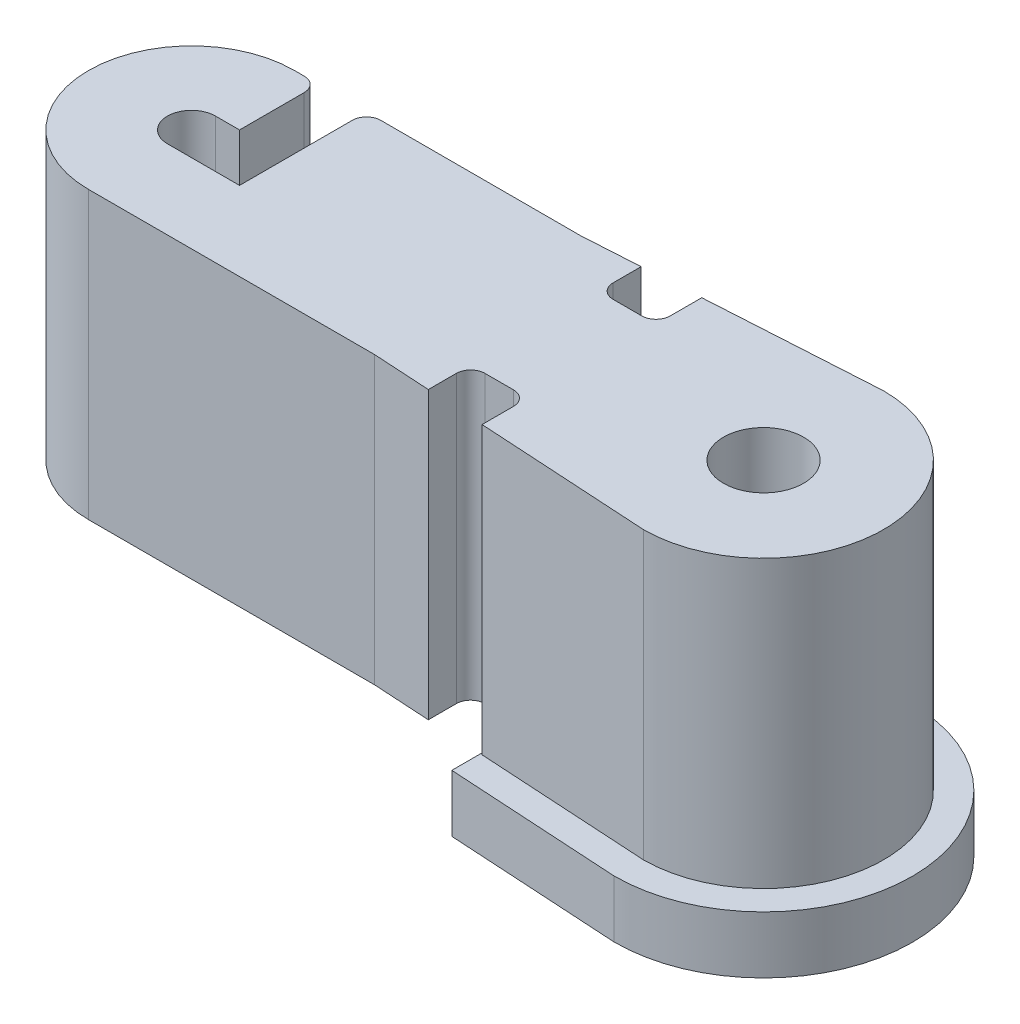
ISO-10303-21;
HEADER;
FILE_DESCRIPTION(('STEP AP214'),'2;1');
FILE_NAME('part.step','',(''),(''),'','','');
FILE_SCHEMA(('AUTOMOTIVE_DESIGN { 1 0 10303 214 1 1 1 1 }'));
ENDSEC;
DATA;
#1=APPLICATION_CONTEXT('core data for automotive mechanical design processes');
#2=APPLICATION_PROTOCOL_DEFINITION('international standard','automotive_design',2000,#1);
#3=PRODUCT_CONTEXT('',#1,'mechanical');
#4=PRODUCT('Part','Part','',(#3));
#5=PRODUCT_RELATED_PRODUCT_CATEGORY('part','',(#4));
#6=PRODUCT_DEFINITION_FORMATION('','',#4);
#7=PRODUCT_DEFINITION_CONTEXT('part definition',#1,'design');
#8=PRODUCT_DEFINITION('design','',#6,#7);
#9=PRODUCT_DEFINITION_SHAPE('','',#8);
#10=(LENGTH_UNIT() NAMED_UNIT(*) SI_UNIT(.MILLI.,.METRE.));
#11=(NAMED_UNIT(*) PLANE_ANGLE_UNIT() SI_UNIT($,.RADIAN.));
#12=(NAMED_UNIT(*) SI_UNIT($,.STERADIAN.) SOLID_ANGLE_UNIT());
#13=UNCERTAINTY_MEASURE_WITH_UNIT(LENGTH_MEASURE(1.E-05),#10,'distance_accuracy_value','');
#14=(GEOMETRIC_REPRESENTATION_CONTEXT(3) GLOBAL_UNCERTAINTY_ASSIGNED_CONTEXT((#13)) GLOBAL_UNIT_ASSIGNED_CONTEXT((#10,
#11,#12)) REPRESENTATION_CONTEXT('',''));
#15=CARTESIAN_POINT('',(0.,0.,0.));
#16=DIRECTION('',(0.,0.,1.));
#17=DIRECTION('',(1.,0.,0.));
#18=AXIS2_PLACEMENT_3D('',#15,#16,#17);
#19=CARTESIAN_POINT('',(0.,0.,0.));
#20=DIRECTION('',(0.,-1.,0.));
#21=DIRECTION('',(0.,0.,-1.));
#22=AXIS2_PLACEMENT_3D('',#19,#20,#21);
#23=PLANE('',#22);
#24=CARTESIAN_POINT('',(-1.625,0.,-0.685));
#25=DIRECTION('',(0.,-1.,0.));
#26=DIRECTION('',(0.,0.,-1.));
#27=AXIS2_PLACEMENT_3D('',#24,#25,#26);
#28=CIRCLE('',#27,0.125);
#29=CARTESIAN_POINT('',(-1.625,0.,-0.56));
#30=VERTEX_POINT('',#29);
#31=CARTESIAN_POINT('',(-1.51497307268199,0.,-0.625678205818127));
#32=VERTEX_POINT('',#31);
#33=EDGE_CURVE('E479',#30,#32,#28,.F.);
#34=ORIENTED_EDGE('',*,*,#33,.T.);
#35=DIRECTION('',(0.,0.,1.));
#36=VECTOR('',#35,1.);
#37=CARTESIAN_POINT('',(-1.51497307268199,0.,1.20955121136645));
#38=LINE('',#37,#36);
#39=CARTESIAN_POINT('',(-1.51497307268199,0.,0.625678205818127));
#40=VERTEX_POINT('',#39);
#41=EDGE_CURVE('E12',#32,#40,#38,.T.);
#42=ORIENTED_EDGE('',*,*,#41,.T.);
#43=CARTESIAN_POINT('',(-1.625,0.,0.685));
#44=DIRECTION('',(0.,-1.,0.));
#45=DIRECTION('',(0.,0.,-1.));
#46=AXIS2_PLACEMENT_3D('',#43,#44,#45);
#47=CIRCLE('',#46,0.125);
#48=CARTESIAN_POINT('',(-1.625,0.,0.56));
#49=VERTEX_POINT('',#48);
#50=EDGE_CURVE('E473',#40,#49,#47,.F.);
#51=ORIENTED_EDGE('',*,*,#50,.T.);
#52=DIRECTION('',(-1.,0.,0.));
#53=VECTOR('',#52,1.);
#54=CARTESIAN_POINT('',(-1.5,0.,0.56));
#55=LINE('',#54,#53);
#56=CARTESIAN_POINT('',(-1.875,0.,0.56));
#57=VERTEX_POINT('',#56);
#58=EDGE_CURVE('E390',#49,#57,#55,.T.);
#59=ORIENTED_EDGE('',*,*,#58,.T.);
#60=CARTESIAN_POINT('',(-1.875,0.,0.685));
#61=DIRECTION('',(0.,-1.,0.));
#62=DIRECTION('',(0.,0.,-1.));
#63=AXIS2_PLACEMENT_3D('',#60,#61,#62);
#64=CIRCLE('',#63,0.125);
#65=CARTESIAN_POINT('',(-2.,0.,0.685));
#66=VERTEX_POINT('',#65);
#67=EDGE_CURVE('E469',#57,#66,#64,.F.);
#68=ORIENTED_EDGE('',*,*,#67,.T.);
#69=DIRECTION('',(0.,0.,-1.));
#70=VECTOR('',#69,1.);
#71=CARTESIAN_POINT('',(-2.,0.,0.93));
#72=LINE('',#71,#70);
#73=CARTESIAN_POINT('',(-2.,0.,0.93));
#74=VERTEX_POINT('',#73);
#75=EDGE_CURVE('E393',#74,#66,#72,.T.);
#76=ORIENTED_EDGE('',*,*,#75,.F.);
#77=DIRECTION('',(0.998204845465779,0.,0.0598922907279451));
#78=VECTOR('',#77,1.);
#79=CARTESIAN_POINT('',(-2.50000000000002,0.,0.9));
#80=LINE('',#79,#78);
#81=CARTESIAN_POINT('',(-2.50000000000002,0.,0.9));
#82=VERTEX_POINT('',#81);
#83=EDGE_CURVE('E396',#82,#74,#80,.T.);
#84=ORIENTED_EDGE('',*,*,#83,.F.);
#85=DIRECTION('',(-1.,0.,0.));
#86=VECTOR('',#85,1.);
#87=CARTESIAN_POINT('',(-2.50000000000002,0.,0.9));
#88=LINE('',#87,#86);
#89=CARTESIAN_POINT('',(-5.,0.,0.9));
#90=VERTEX_POINT('',#89);
#91=EDGE_CURVE('E398',#82,#90,#88,.T.);
#92=ORIENTED_EDGE('',*,*,#91,.T.);
#93=CARTESIAN_POINT('',(-5.,0.,0.));
#94=DIRECTION('',(0.,1.,0.));
#95=DIRECTION('',(0.,0.,1.));
#96=AXIS2_PLACEMENT_3D('',#93,#94,#95);
#97=CIRCLE('',#96,0.9);
#98=CARTESIAN_POINT('',(-5.,0.,-0.9));
#99=VERTEX_POINT('',#98);
#100=EDGE_CURVE('E401',#99,#90,#97,.T.);
#101=ORIENTED_EDGE('',*,*,#100,.F.);
#102=DIRECTION('',(-1.,0.,0.));
#103=VECTOR('',#102,1.);
#104=CARTESIAN_POINT('',(-2.50000000000002,0.,-0.9));
#105=LINE('',#104,#103);
#106=CARTESIAN_POINT('',(-4.915,0.,-0.9));
#107=VERTEX_POINT('',#106);
#108=EDGE_CURVE('E404',#107,#99,#105,.T.);
#109=ORIENTED_EDGE('',*,*,#108,.F.);
#110=CARTESIAN_POINT('',(-4.915,0.,-0.775));
#111=DIRECTION('',(0.,-1.,0.));
#112=DIRECTION('',(0.,0.,-1.));
#113=AXIS2_PLACEMENT_3D('',#110,#111,#112);
#114=CIRCLE('',#113,0.125);
#115=CARTESIAN_POINT('',(-4.79,0.,-0.775));
#116=VERTEX_POINT('',#115);
#117=EDGE_CURVE('E441',#107,#116,#114,.T.);
#118=ORIENTED_EDGE('',*,*,#117,.T.);
#119=DIRECTION('',(0.,0.,1.));
#120=VECTOR('',#119,1.);
#121=CARTESIAN_POINT('',(-4.79,0.,0.));
#122=LINE('',#121,#120);
#123=CARTESIAN_POINT('',(-4.79,0.,-0.21));
#124=VERTEX_POINT('',#123);
#125=EDGE_CURVE('E298',#116,#124,#122,.T.);
#126=ORIENTED_EDGE('',*,*,#125,.T.);
#127=DIRECTION('',(1.,0.,0.));
#128=VECTOR('',#127,1.);
#129=CARTESIAN_POINT('',(0.,0.,-0.210000000000002));
#130=LINE('',#129,#128);
#131=CARTESIAN_POINT('',(-5.,0.,-0.21));
#132=VERTEX_POINT('',#131);
#133=EDGE_CURVE('E286',#132,#124,#130,.T.);
#134=ORIENTED_EDGE('',*,*,#133,.F.);
#135=CARTESIAN_POINT('',(-5.,0.,0.));
#136=DIRECTION('',(0.,1.,0.));
#137=DIRECTION('',(0.,0.,1.));
#138=AXIS2_PLACEMENT_3D('',#135,#136,#137);
#139=CIRCLE('',#138,0.21);
#140=CARTESIAN_POINT('',(-5.,0.,0.21));
#141=VERTEX_POINT('',#140);
#142=EDGE_CURVE('E289',#132,#141,#139,.T.);
#143=ORIENTED_EDGE('',*,*,#142,.T.);
#144=DIRECTION('',(-1.,0.,0.));
#145=VECTOR('',#144,1.);
#146=CARTESIAN_POINT('',(0.,0.,0.209999999999999));
#147=LINE('',#146,#145);
#148=CARTESIAN_POINT('',(-4.37,0.,0.21));
#149=VERTEX_POINT('',#148);
#150=EDGE_CURVE('E293',#149,#141,#147,.T.);
#151=ORIENTED_EDGE('',*,*,#150,.F.);
#152=DIRECTION('',(0.,0.,1.));
#153=VECTOR('',#152,1.);
#154=CARTESIAN_POINT('',(-4.37,0.,0.));
#155=LINE('',#154,#153);
#156=CARTESIAN_POINT('',(-4.37,0.,-0.775));
#157=VERTEX_POINT('',#156);
#158=EDGE_CURVE('E296',#157,#149,#155,.T.);
#159=ORIENTED_EDGE('',*,*,#158,.F.);
#160=CARTESIAN_POINT('',(-4.245,0.,-0.775));
#161=DIRECTION('',(0.,-1.,0.));
#162=DIRECTION('',(0.,0.,-1.));
#163=AXIS2_PLACEMENT_3D('',#160,#161,#162);
#164=CIRCLE('',#163,0.125);
#165=CARTESIAN_POINT('',(-4.245,0.,-0.9));
#166=VERTEX_POINT('',#165);
#167=EDGE_CURVE('E443',#157,#166,#164,.T.);
#168=ORIENTED_EDGE('',*,*,#167,.T.);
#169=CARTESIAN_POINT('',(-2.50000000000002,0.,-0.9));
#170=VERTEX_POINT('',#169);
#171=EDGE_CURVE('E332',#170,#166,#105,.T.);
#172=ORIENTED_EDGE('',*,*,#171,.F.);
#173=DIRECTION('',(0.998204845465779,0.,-0.0598922907279451));
#174=VECTOR('',#173,1.);
#175=CARTESIAN_POINT('',(-2.50000000000002,0.,-0.9));
#176=LINE('',#175,#174);
#177=CARTESIAN_POINT('',(-2.,0.,-0.93));
#178=VERTEX_POINT('',#177);
#179=EDGE_CURVE('E317',#170,#178,#176,.T.);
#180=ORIENTED_EDGE('',*,*,#179,.T.);
#181=DIRECTION('',(0.,0.,1.));
#182=VECTOR('',#181,1.);
#183=CARTESIAN_POINT('',(-2.,0.,-0.93));
#184=LINE('',#183,#182);
#185=CARTESIAN_POINT('',(-2.,0.,-0.685));
#186=VERTEX_POINT('',#185);
#187=EDGE_CURVE('E372',#178,#186,#184,.T.);
#188=ORIENTED_EDGE('',*,*,#187,.T.);
#189=CARTESIAN_POINT('',(-1.875,0.,-0.685));
#190=DIRECTION('',(0.,-1.,0.));
#191=DIRECTION('',(0.,0.,-1.));
#192=AXIS2_PLACEMENT_3D('',#189,#190,#191);
#193=CIRCLE('',#192,0.125);
#194=CARTESIAN_POINT('',(-1.875,0.,-0.56));
#195=VERTEX_POINT('',#194);
#196=EDGE_CURVE('E483',#186,#195,#193,.F.);
#197=ORIENTED_EDGE('',*,*,#196,.T.);
#198=DIRECTION('',(1.,0.,0.));
#199=VECTOR('',#198,1.);
#200=CARTESIAN_POINT('',(-2.,0.,-0.56));
#201=LINE('',#200,#199);
#202=EDGE_CURVE('E375',#195,#30,#201,.T.);
#203=ORIENTED_EDGE('',*,*,#202,.T.);
#204=EDGE_LOOP('',(#34,#42,#51,#59,#68,#76,#84,#92,#101,#109,#118,#126,#134,#143,#151,#159,#168,
#172,#180,#188,#197,#203));
#205=FACE_BOUND('',#204,.T.);
#206=ADVANCED_FACE('F36',(#205),#23,.T.);
#207=CARTESIAN_POINT('',(-2.50000000000002,2.5,-0.9));
#208=DIRECTION('',(0.,0.,1.));
#209=DIRECTION('',(1.,0.,0.));
#210=AXIS2_PLACEMENT_3D('',#207,#208,#209);
#211=PLANE('',#210);
#212=ORIENTED_EDGE('',*,*,#171,.T.);
#213=DIRECTION('',(0.,1.,0.));
#214=VECTOR('',#213,1.);
#215=CARTESIAN_POINT('',(-4.245,2.5,-0.9));
#216=LINE('',#215,#214);
#217=CARTESIAN_POINT('',(-4.245,2.5,-0.9));
#218=VERTEX_POINT('',#217);
#219=EDGE_CURVE('E409',#166,#218,#216,.T.);
#220=ORIENTED_EDGE('',*,*,#219,.T.);
#221=DIRECTION('',(-1.,0.,0.));
#222=VECTOR('',#221,1.);
#223=CARTESIAN_POINT('',(-2.50000000000002,2.5,-0.9));
#224=LINE('',#223,#222);
#225=CARTESIAN_POINT('',(-2.50000000000002,2.5,-0.9));
#226=VERTEX_POINT('',#225);
#227=EDGE_CURVE('E366',#226,#218,#224,.T.);
#228=ORIENTED_EDGE('',*,*,#227,.F.);
#229=DIRECTION('',(0.,-1.,0.));
#230=VECTOR('',#229,1.);
#231=CARTESIAN_POINT('',(-2.50000000000002,2.5,-0.9));
#232=LINE('',#231,#230);
#233=EDGE_CURVE('E407',#226,#170,#232,.T.);
#234=ORIENTED_EDGE('',*,*,#233,.T.);
#235=EDGE_LOOP('',(#212,#220,#228,#234));
#236=FACE_BOUND('',#235,.T.);
#237=ADVANCED_FACE('F597',(#236),#211,.F.);
#238=CARTESIAN_POINT('',(-2.50000000000002,2.5,-0.9));
#239=DIRECTION('',(-0.0598922907279451,0.,-0.998204845465779));
#240=DIRECTION('',(-0.998204845465779,0.,0.0598922907279451));
#241=AXIS2_PLACEMENT_3D('',#238,#239,#240);
#242=PLANE('',#241);
#243=ORIENTED_EDGE('',*,*,#179,.F.);
#244=ORIENTED_EDGE('',*,*,#233,.F.);
#245=DIRECTION('',(0.998204845465779,0.,-0.0598922907279451));
#246=VECTOR('',#245,1.);
#247=CARTESIAN_POINT('',(-2.50000000000002,2.5,-0.9));
#248=LINE('',#247,#246);
#249=CARTESIAN_POINT('',(-2.,2.5,-0.93));
#250=VERTEX_POINT('',#249);
#251=EDGE_CURVE('E328',#226,#250,#248,.T.);
#252=ORIENTED_EDGE('',*,*,#251,.T.);
#253=DIRECTION('',(0.,-1.,0.));
#254=VECTOR('',#253,1.);
#255=CARTESIAN_POINT('',(-2.,2.5,-0.93));
#256=LINE('',#255,#254);
#257=EDGE_CURVE('E369',#250,#178,#256,.T.);
#258=ORIENTED_EDGE('',*,*,#257,.T.);
#259=EDGE_LOOP('',(#243,#244,#252,#258));
#260=FACE_BOUND('',#259,.T.);
#261=ADVANCED_FACE('F600',(#260),#242,.T.);
#262=CARTESIAN_POINT('',(-4.915,2.5,-0.9));
#263=VERTEX_POINT('',#262);
#264=CARTESIAN_POINT('',(-5.,2.5,-0.9));
#265=VERTEX_POINT('',#264);
#266=EDGE_CURVE('E365',#263,#265,#224,.T.);
#267=ORIENTED_EDGE('',*,*,#266,.F.);
#268=DIRECTION('',(0.,1.,0.));
#269=VECTOR('',#268,1.);
#270=CARTESIAN_POINT('',(-4.915,2.5,-0.9));
#271=LINE('',#270,#269);
#272=EDGE_CURVE('E61',#263,#107,#271,.F.);
#273=ORIENTED_EDGE('',*,*,#272,.T.);
#274=ORIENTED_EDGE('',*,*,#108,.T.);
#275=DIRECTION('',(0.,-1.,0.));
#276=VECTOR('',#275,1.);
#277=CARTESIAN_POINT('',(-5.,2.5,-0.9));
#278=LINE('',#277,#276);
#279=EDGE_CURVE('E410',#265,#99,#278,.T.);
#280=ORIENTED_EDGE('',*,*,#279,.F.);
#281=EDGE_LOOP('',(#267,#273,#274,#280));
#282=FACE_BOUND('',#281,.T.);
#283=ADVANCED_FACE('F602',(#282),#211,.F.);
#284=CARTESIAN_POINT('',(-5.,2.5,0.));
#285=DIRECTION('',(0.,-1.,0.));
#286=DIRECTION('',(0.,0.,-1.));
#287=AXIS2_PLACEMENT_3D('',#284,#285,#286);
#288=CYLINDRICAL_SURFACE('',#287,0.9);
#289=ORIENTED_EDGE('',*,*,#100,.T.);
#290=DIRECTION('',(0.,-1.,0.));
#291=VECTOR('',#290,1.);
#292=CARTESIAN_POINT('',(-5.,2.5,0.9));
#293=LINE('',#292,#291);
#294=CARTESIAN_POINT('',(-5.,2.5,0.9));
#295=VERTEX_POINT('',#294);
#296=EDGE_CURVE('E413',#295,#90,#293,.T.);
#297=ORIENTED_EDGE('',*,*,#296,.F.);
#298=CARTESIAN_POINT('',(-5.,2.5,0.));
#299=DIRECTION('',(0.,1.,0.));
#300=DIRECTION('',(0.,0.,1.));
#301=AXIS2_PLACEMENT_3D('',#298,#299,#300);
#302=CIRCLE('',#301,0.9);
#303=EDGE_CURVE('E363',#265,#295,#302,.T.);
#304=ORIENTED_EDGE('',*,*,#303,.F.);
#305=ORIENTED_EDGE('',*,*,#279,.T.);
#306=EDGE_LOOP('',(#289,#297,#304,#305));
#307=FACE_BOUND('',#306,.T.);
#308=ADVANCED_FACE('F561',(#307),#288,.T.);
#309=CARTESIAN_POINT('',(-2.50000000000002,2.5,0.9));
#310=DIRECTION('',(0.,0.,1.));
#311=DIRECTION('',(1.,0.,0.));
#312=AXIS2_PLACEMENT_3D('',#309,#310,#311);
#313=PLANE('',#312);
#314=ORIENTED_EDGE('',*,*,#91,.F.);
#315=DIRECTION('',(0.,-1.,0.));
#316=VECTOR('',#315,1.);
#317=CARTESIAN_POINT('',(-2.50000000000002,2.5,0.9));
#318=LINE('',#317,#316);
#319=CARTESIAN_POINT('',(-2.50000000000002,2.5,0.9));
#320=VERTEX_POINT('',#319);
#321=EDGE_CURVE('E415',#320,#82,#318,.T.);
#322=ORIENTED_EDGE('',*,*,#321,.F.);
#323=DIRECTION('',(-1.,0.,0.));
#324=VECTOR('',#323,1.);
#325=CARTESIAN_POINT('',(-2.50000000000002,2.5,0.9));
#326=LINE('',#325,#324);
#327=EDGE_CURVE('E360',#320,#295,#326,.T.);
#328=ORIENTED_EDGE('',*,*,#327,.T.);
#329=ORIENTED_EDGE('',*,*,#296,.T.);
#330=EDGE_LOOP('',(#314,#322,#328,#329));
#331=FACE_BOUND('',#330,.T.);
#332=ADVANCED_FACE('F557',(#331),#313,.T.);
#333=CARTESIAN_POINT('',(-2.50000000000002,2.5,0.9));
#334=DIRECTION('',(0.0598922907279451,0.,-0.998204845465779));
#335=DIRECTION('',(-0.998204845465779,0.,-0.0598922907279451));
#336=AXIS2_PLACEMENT_3D('',#333,#334,#335);
#337=PLANE('',#336);
#338=ORIENTED_EDGE('',*,*,#83,.T.);
#339=DIRECTION('',(0.,-1.,0.));
#340=VECTOR('',#339,1.);
#341=CARTESIAN_POINT('',(-2.,2.5,0.93));
#342=LINE('',#341,#340);
#343=CARTESIAN_POINT('',(-2.,2.5,0.93));
#344=VERTEX_POINT('',#343);
#345=EDGE_CURVE('E417',#344,#74,#342,.T.);
#346=ORIENTED_EDGE('',*,*,#345,.F.);
#347=DIRECTION('',(0.998204845465779,0.,0.0598922907279451));
#348=VECTOR('',#347,1.);
#349=CARTESIAN_POINT('',(-2.50000000000002,2.5,0.9));
#350=LINE('',#349,#348);
#351=EDGE_CURVE('E358',#320,#344,#350,.T.);
#352=ORIENTED_EDGE('',*,*,#351,.F.);
#353=ORIENTED_EDGE('',*,*,#321,.T.);
#354=EDGE_LOOP('',(#338,#346,#352,#353));
#355=FACE_BOUND('',#354,.T.);
#356=ADVANCED_FACE('F552',(#355),#337,.F.);
#357=CARTESIAN_POINT('',(-2.,2.5,0.93));
#358=DIRECTION('',(-1.,0.,0.));
#359=DIRECTION('',(0.,0.,1.));
#360=AXIS2_PLACEMENT_3D('',#357,#358,#359);
#361=PLANE('',#360);
#362=ORIENTED_EDGE('',*,*,#75,.T.);
#363=DIRECTION('',(0.,-1.,0.));
#364=VECTOR('',#363,1.);
#365=CARTESIAN_POINT('',(-2.,2.5,0.685));
#366=LINE('',#365,#364);
#367=CARTESIAN_POINT('',(-2.,2.5,0.685));
#368=VERTEX_POINT('',#367);
#369=EDGE_CURVE('E454',#66,#368,#366,.F.);
#370=ORIENTED_EDGE('',*,*,#369,.T.);
#371=DIRECTION('',(0.,0.,-1.));
#372=VECTOR('',#371,1.);
#373=CARTESIAN_POINT('',(-2.,2.5,0.93));
#374=LINE('',#373,#372);
#375=EDGE_CURVE('E355',#344,#368,#374,.T.);
#376=ORIENTED_EDGE('',*,*,#375,.F.);
#377=ORIENTED_EDGE('',*,*,#345,.T.);
#378=EDGE_LOOP('',(#362,#370,#376,#377));
#379=FACE_BOUND('',#378,.T.);
#380=ADVANCED_FACE('F547',(#379),#361,.F.);
#381=CARTESIAN_POINT('',(-1.5,2.5,0.56));
#382=DIRECTION('',(0.,0.,1.));
#383=DIRECTION('',(1.,0.,0.));
#384=AXIS2_PLACEMENT_3D('',#381,#382,#383);
#385=PLANE('',#384);
#386=DIRECTION('',(-1.,0.,0.));
#387=VECTOR('',#386,1.);
#388=CARTESIAN_POINT('',(-1.5,2.5,0.56));
#389=LINE('',#388,#387);
#390=CARTESIAN_POINT('',(-1.625,2.5,0.56));
#391=VERTEX_POINT('',#390);
#392=CARTESIAN_POINT('',(-1.875,2.5,0.56));
#393=VERTEX_POINT('',#392);
#394=EDGE_CURVE('E352',#391,#393,#389,.T.);
#395=ORIENTED_EDGE('',*,*,#394,.T.);
#396=DIRECTION('',(0.,-1.,0.));
#397=VECTOR('',#396,1.);
#398=CARTESIAN_POINT('',(-1.875,2.5,0.56));
#399=LINE('',#398,#397);
#400=EDGE_CURVE('E451',#393,#57,#399,.T.);
#401=ORIENTED_EDGE('',*,*,#400,.T.);
#402=ORIENTED_EDGE('',*,*,#58,.F.);
#403=DIRECTION('',(0.,-1.,0.));
#404=VECTOR('',#403,1.);
#405=CARTESIAN_POINT('',(-1.625,2.5,0.56));
#406=LINE('',#405,#404);
#407=EDGE_CURVE('E449',#49,#391,#406,.F.);
#408=ORIENTED_EDGE('',*,*,#407,.T.);
#409=EDGE_LOOP('',(#395,#401,#402,#408));
#410=FACE_BOUND('',#409,.T.);
#411=ADVANCED_FACE('F537',(#410),#385,.T.);
#412=CARTESIAN_POINT('',(-1.5,2.5,0.56));
#413=DIRECTION('',(1.,0.,0.));
#414=DIRECTION('',(0.,0.,-1.));
#415=AXIS2_PLACEMENT_3D('',#412,#413,#414);
#416=PLANE('',#415);
#417=DIRECTION('',(0.,0.,1.));
#418=VECTOR('',#417,1.);
#419=CARTESIAN_POINT('',(-1.5,2.5,0.56));
#420=LINE('',#419,#418);
#421=CARTESIAN_POINT('',(-1.5,2.5,0.685));
#422=VERTEX_POINT('',#421);
#423=CARTESIAN_POINT('',(-1.5,2.5,0.96));
#424=VERTEX_POINT('',#423);
#425=EDGE_CURVE('E350',#422,#424,#420,.T.);
#426=ORIENTED_EDGE('',*,*,#425,.F.);
#427=DIRECTION('',(0.,-1.,0.));
#428=VECTOR('',#427,1.);
#429=CARTESIAN_POINT('',(-1.5,2.5,0.685));
#430=LINE('',#429,#428);
#431=CARTESIAN_POINT('',(-1.5,0.,0.685));
#432=VERTEX_POINT('',#431);
#433=EDGE_CURVE('E456',#422,#432,#430,.T.);
#434=ORIENTED_EDGE('',*,*,#433,.T.);
#435=DIRECTION('',(0.,0.,1.));
#436=VECTOR('',#435,1.);
#437=CARTESIAN_POINT('',(-1.5,0.,0.56));
#438=LINE('',#437,#436);
#439=CARTESIAN_POINT('',(-1.5,0.,0.96));
#440=VERTEX_POINT('',#439);
#441=EDGE_CURVE('E387',#432,#440,#438,.T.);
#442=ORIENTED_EDGE('',*,*,#441,.T.);
#443=DIRECTION('',(0.,-1.,0.));
#444=VECTOR('',#443,1.);
#445=CARTESIAN_POINT('',(-1.5,2.5,0.96));
#446=LINE('',#445,#444);
#447=EDGE_CURVE('E420',#424,#440,#446,.T.);
#448=ORIENTED_EDGE('',*,*,#447,.F.);
#449=EDGE_LOOP('',(#426,#434,#442,#448));
#450=FACE_BOUND('',#449,.T.);
#451=ADVANCED_FACE('F528',(#450),#416,.F.);
#452=CARTESIAN_POINT('',(0.,2.5,1.05));
#453=DIRECTION('',(-0.0598922907279466,0.,0.998204845465779));
#454=DIRECTION('',(0.998204845465779,0.,0.0598922907279466));
#455=AXIS2_PLACEMENT_3D('',#452,#453,#454);
#456=PLANE('',#455);
#457=DIRECTION('',(-0.998204845465779,0.,-0.0598922907279466));
#458=VECTOR('',#457,1.);
#459=CARTESIAN_POINT('',(0.,0.,1.05));
#460=LINE('',#459,#458);
#461=CARTESIAN_POINT('',(0.,0.,1.05));
#462=VERTEX_POINT('',#461);
#463=EDGE_CURVE('E385',#462,#440,#460,.T.);
#464=ORIENTED_EDGE('',*,*,#463,.F.);
#465=DIRECTION('',(0.,-1.,0.));
#466=VECTOR('',#465,1.);
#467=CARTESIAN_POINT('',(0.,2.5,1.05));
#468=LINE('',#467,#466);
#469=CARTESIAN_POINT('',(0.,2.5,1.05));
#470=VERTEX_POINT('',#469);
#471=EDGE_CURVE('E423',#470,#462,#468,.T.);
#472=ORIENTED_EDGE('',*,*,#471,.F.);
#473=DIRECTION('',(-0.998204845465779,0.,-0.0598922907279466));
#474=VECTOR('',#473,1.);
#475=CARTESIAN_POINT('',(0.,2.5,1.05));
#476=LINE('',#475,#474);
#477=EDGE_CURVE('E347',#470,#424,#476,.T.);
#478=ORIENTED_EDGE('',*,*,#477,.T.);
#479=ORIENTED_EDGE('',*,*,#447,.T.);
#480=EDGE_LOOP('',(#464,#472,#478,#479));
#481=FACE_BOUND('',#480,.T.);
#482=ADVANCED_FACE('F524',(#481),#456,.T.);
#483=CARTESIAN_POINT('',(0.,2.5,0.));
#484=DIRECTION('',(0.,-1.,0.));
#485=DIRECTION('',(0.,0.,-1.));
#486=AXIS2_PLACEMENT_3D('',#483,#484,#485);
#487=CYLINDRICAL_SURFACE('',#486,1.05);
#488=CARTESIAN_POINT('',(0.,0.,0.));
#489=DIRECTION('',(0.,-1.,0.));
#490=DIRECTION('',(0.,0.,-1.));
#491=AXIS2_PLACEMENT_3D('',#488,#489,#490);
#492=CIRCLE('',#491,1.05);
#493=CARTESIAN_POINT('',(0.,0.,-1.05));
#494=VERTEX_POINT('',#493);
#495=EDGE_CURVE('E383',#494,#462,#492,.T.);
#496=ORIENTED_EDGE('',*,*,#495,.F.);
#497=DIRECTION('',(0.,-1.,0.));
#498=VECTOR('',#497,1.);
#499=CARTESIAN_POINT('',(0.,2.5,-1.05));
#500=LINE('',#499,#498);
#501=CARTESIAN_POINT('',(0.,2.5,-1.05));
#502=VERTEX_POINT('',#501);
#503=EDGE_CURVE('E426',#502,#494,#500,.T.);
#504=ORIENTED_EDGE('',*,*,#503,.F.);
#505=CARTESIAN_POINT('',(0.,2.5,0.));
#506=DIRECTION('',(0.,-1.,0.));
#507=DIRECTION('',(0.,0.,-1.));
#508=AXIS2_PLACEMENT_3D('',#505,#506,#507);
#509=CIRCLE('',#508,1.05);
#510=EDGE_CURVE('E344',#502,#470,#509,.T.);
#511=ORIENTED_EDGE('',*,*,#510,.T.);
#512=ORIENTED_EDGE('',*,*,#471,.T.);
#513=EDGE_LOOP('',(#496,#504,#511,#512));
#514=FACE_BOUND('',#513,.T.);
#515=ADVANCED_FACE('F520',(#514),#487,.T.);
#516=CARTESIAN_POINT('',(-1.5,2.5,-0.96));
#517=DIRECTION('',(-0.0598922907279466,0.,-0.998204845465779));
#518=DIRECTION('',(-0.998204845465779,0.,0.0598922907279466));
#519=AXIS2_PLACEMENT_3D('',#516,#517,#518);
#520=PLANE('',#519);
#521=DIRECTION('',(0.998204845465779,0.,-0.0598922907279466));
#522=VECTOR('',#521,1.);
#523=CARTESIAN_POINT('',(-1.5,0.,-0.96));
#524=LINE('',#523,#522);
#525=CARTESIAN_POINT('',(-1.5,0.,-0.96));
#526=VERTEX_POINT('',#525);
#527=EDGE_CURVE('E381',#526,#494,#524,.T.);
#528=ORIENTED_EDGE('',*,*,#527,.F.);
#529=DIRECTION('',(0.,-1.,0.));
#530=VECTOR('',#529,1.);
#531=CARTESIAN_POINT('',(-1.5,2.5,-0.96));
#532=LINE('',#531,#530);
#533=CARTESIAN_POINT('',(-1.5,2.5,-0.96));
#534=VERTEX_POINT('',#533);
#535=EDGE_CURVE('E429',#534,#526,#532,.T.);
#536=ORIENTED_EDGE('',*,*,#535,.F.);
#537=DIRECTION('',(0.998204845465779,0.,-0.0598922907279466));
#538=VECTOR('',#537,1.);
#539=CARTESIAN_POINT('',(-1.5,2.5,-0.96));
#540=LINE('',#539,#538);
#541=EDGE_CURVE('E341',#534,#502,#540,.T.);
#542=ORIENTED_EDGE('',*,*,#541,.T.);
#543=ORIENTED_EDGE('',*,*,#503,.T.);
#544=EDGE_LOOP('',(#528,#536,#542,#543));
#545=FACE_BOUND('',#544,.T.);
#546=ADVANCED_FACE('F516',(#545),#520,.T.);
#547=CARTESIAN_POINT('',(-1.5,2.5,-0.96));
#548=DIRECTION('',(1.,0.,0.));
#549=DIRECTION('',(0.,0.,-1.));
#550=AXIS2_PLACEMENT_3D('',#547,#548,#549);
#551=PLANE('',#550);
#552=DIRECTION('',(0.,0.,1.));
#553=VECTOR('',#552,1.);
#554=CARTESIAN_POINT('',(-1.5,0.,-0.96));
#555=LINE('',#554,#553);
#556=CARTESIAN_POINT('',(-1.5,0.,-0.685));
#557=VERTEX_POINT('',#556);
#558=EDGE_CURVE('E378',#526,#557,#555,.T.);
#559=ORIENTED_EDGE('',*,*,#558,.T.);
#560=DIRECTION('',(0.,-1.,0.));
#561=VECTOR('',#560,1.);
#562=CARTESIAN_POINT('',(-1.5,2.5,-0.685));
#563=LINE('',#562,#561);
#564=CARTESIAN_POINT('',(-1.5,2.5,-0.685));
#565=VERTEX_POINT('',#564);
#566=EDGE_CURVE('E464',#557,#565,#563,.F.);
#567=ORIENTED_EDGE('',*,*,#566,.T.);
#568=DIRECTION('',(0.,0.,1.));
#569=VECTOR('',#568,1.);
#570=CARTESIAN_POINT('',(-1.5,2.5,-0.96));
#571=LINE('',#570,#569);
#572=EDGE_CURVE('E338',#534,#565,#571,.T.);
#573=ORIENTED_EDGE('',*,*,#572,.F.);
#574=ORIENTED_EDGE('',*,*,#535,.T.);
#575=EDGE_LOOP('',(#559,#567,#573,#574));
#576=FACE_BOUND('',#575,.T.);
#577=ADVANCED_FACE('F511',(#576),#551,.F.);
#578=CARTESIAN_POINT('',(-2.,2.5,-0.56));
#579=DIRECTION('',(0.,0.,-1.));
#580=DIRECTION('',(-1.,0.,0.));
#581=AXIS2_PLACEMENT_3D('',#578,#579,#580);
#582=PLANE('',#581);
#583=DIRECTION('',(1.,0.,0.));
#584=VECTOR('',#583,1.);
#585=CARTESIAN_POINT('',(-2.,2.5,-0.56));
#586=LINE('',#585,#584);
#587=CARTESIAN_POINT('',(-1.875,2.5,-0.56));
#588=VERTEX_POINT('',#587);
#589=CARTESIAN_POINT('',(-1.625,2.5,-0.56));
#590=VERTEX_POINT('',#589);
#591=EDGE_CURVE('E335',#588,#590,#586,.T.);
#592=ORIENTED_EDGE('',*,*,#591,.T.);
#593=DIRECTION('',(0.,-1.,0.));
#594=VECTOR('',#593,1.);
#595=CARTESIAN_POINT('',(-1.625,2.5,-0.56));
#596=LINE('',#595,#594);
#597=EDGE_CURVE('E461',#590,#30,#596,.T.);
#598=ORIENTED_EDGE('',*,*,#597,.T.);
#599=ORIENTED_EDGE('',*,*,#202,.F.);
#600=DIRECTION('',(0.,-1.,0.));
#601=VECTOR('',#600,1.);
#602=CARTESIAN_POINT('',(-1.875,2.5,-0.56));
#603=LINE('',#602,#601);
#604=EDGE_CURVE('E459',#195,#588,#603,.F.);
#605=ORIENTED_EDGE('',*,*,#604,.T.);
#606=EDGE_LOOP('',(#592,#598,#599,#605));
#607=FACE_BOUND('',#606,.T.);
#608=ADVANCED_FACE('F500',(#607),#582,.T.);
#609=CARTESIAN_POINT('',(-2.,2.5,-0.93));
#610=DIRECTION('',(1.,0.,0.));
#611=DIRECTION('',(0.,0.,-1.));
#612=AXIS2_PLACEMENT_3D('',#609,#610,#611);
#613=PLANE('',#612);
#614=DIRECTION('',(0.,0.,1.));
#615=VECTOR('',#614,1.);
#616=CARTESIAN_POINT('',(-2.,2.5,-0.93));
#617=LINE('',#616,#615);
#618=CARTESIAN_POINT('',(-2.,2.5,-0.685));
#619=VERTEX_POINT('',#618);
#620=EDGE_CURVE('E331',#250,#619,#617,.T.);
#621=ORIENTED_EDGE('',*,*,#620,.T.);
#622=DIRECTION('',(0.,-1.,0.));
#623=VECTOR('',#622,1.);
#624=CARTESIAN_POINT('',(-2.,0.,-0.685));
#625=LINE('',#624,#623);
#626=EDGE_CURVE('E466',#619,#186,#625,.T.);
#627=ORIENTED_EDGE('',*,*,#626,.T.);
#628=ORIENTED_EDGE('',*,*,#187,.F.);
#629=ORIENTED_EDGE('',*,*,#257,.F.);
#630=EDGE_LOOP('',(#621,#627,#628,#629));
#631=FACE_BOUND('',#630,.T.);
#632=ADVANCED_FACE('F497',(#631),#613,.T.);
#633=CARTESIAN_POINT('',(0.,2.5,0.));
#634=DIRECTION('',(0.,-1.,0.));
#635=DIRECTION('',(0.,0.,-1.));
#636=AXIS2_PLACEMENT_3D('',#633,#634,#635);
#637=PLANE('',#636);
#638=ORIENTED_EDGE('',*,*,#227,.T.);
#639=CARTESIAN_POINT('',(-4.245,2.5,-0.775));
#640=DIRECTION('',(0.,-1.,0.));
#641=DIRECTION('',(0.,0.,-1.));
#642=AXIS2_PLACEMENT_3D('',#639,#640,#641);
#643=CIRCLE('',#642,0.125);
#644=CARTESIAN_POINT('',(-4.37,2.5,-0.775));
#645=VERTEX_POINT('',#644);
#646=EDGE_CURVE('E437',#218,#645,#643,.F.);
#647=ORIENTED_EDGE('',*,*,#646,.T.);
#648=DIRECTION('',(0.,0.,1.));
#649=VECTOR('',#648,1.);
#650=CARTESIAN_POINT('',(-4.37,2.5,0.));
#651=LINE('',#650,#649);
#652=CARTESIAN_POINT('',(-4.37,2.5,0.21));
#653=VERTEX_POINT('',#652);
#654=EDGE_CURVE('E311',#645,#653,#651,.T.);
#655=ORIENTED_EDGE('',*,*,#654,.T.);
#656=DIRECTION('',(-1.,0.,0.));
#657=VECTOR('',#656,1.);
#658=CARTESIAN_POINT('',(0.,2.5,0.209999999999999));
#659=LINE('',#658,#657);
#660=CARTESIAN_POINT('',(-5.,2.5,0.21));
#661=VERTEX_POINT('',#660);
#662=EDGE_CURVE('E308',#653,#661,#659,.T.);
#663=ORIENTED_EDGE('',*,*,#662,.T.);
#664=CARTESIAN_POINT('',(-5.,2.5,0.));
#665=DIRECTION('',(0.,1.,0.));
#666=DIRECTION('',(0.,0.,1.));
#667=AXIS2_PLACEMENT_3D('',#664,#665,#666);
#668=CIRCLE('',#667,0.21);
#669=CARTESIAN_POINT('',(-5.,2.5,-0.21));
#670=VERTEX_POINT('',#669);
#671=EDGE_CURVE('E304',#670,#661,#668,.T.);
#672=ORIENTED_EDGE('',*,*,#671,.F.);
#673=DIRECTION('',(1.,0.,0.));
#674=VECTOR('',#673,1.);
#675=CARTESIAN_POINT('',(0.,2.5,-0.210000000000002));
#676=LINE('',#675,#674);
#677=CARTESIAN_POINT('',(-4.79,2.5,-0.21));
#678=VERTEX_POINT('',#677);
#679=EDGE_CURVE('E301',#670,#678,#676,.T.);
#680=ORIENTED_EDGE('',*,*,#679,.T.);
#681=DIRECTION('',(0.,0.,1.));
#682=VECTOR('',#681,1.);
#683=CARTESIAN_POINT('',(-4.79,2.5,0.));
#684=LINE('',#683,#682);
#685=CARTESIAN_POINT('',(-4.79,2.5,-0.775));
#686=VERTEX_POINT('',#685);
#687=EDGE_CURVE('E290',#686,#678,#684,.T.);
#688=ORIENTED_EDGE('',*,*,#687,.F.);
#689=CARTESIAN_POINT('',(-4.915,2.5,-0.775));
#690=DIRECTION('',(0.,-1.,0.));
#691=DIRECTION('',(0.,0.,-1.));
#692=AXIS2_PLACEMENT_3D('',#689,#690,#691);
#693=CIRCLE('',#692,0.125);
#694=EDGE_CURVE('E435',#686,#263,#693,.F.);
#695=ORIENTED_EDGE('',*,*,#694,.T.);
#696=ORIENTED_EDGE('',*,*,#266,.T.);
#697=ORIENTED_EDGE('',*,*,#303,.T.);
#698=ORIENTED_EDGE('',*,*,#327,.F.);
#699=ORIENTED_EDGE('',*,*,#351,.T.);
#700=ORIENTED_EDGE('',*,*,#375,.T.);
#701=CARTESIAN_POINT('',(-1.875,2.5,0.685));
#702=DIRECTION('',(0.,-1.,0.));
#703=DIRECTION('',(0.,0.,-1.));
#704=AXIS2_PLACEMENT_3D('',#701,#702,#703);
#705=CIRCLE('',#704,0.125);
#706=EDGE_CURVE('E471',#368,#393,#705,.T.);
#707=ORIENTED_EDGE('',*,*,#706,.T.);
#708=ORIENTED_EDGE('',*,*,#394,.F.);
#709=CARTESIAN_POINT('',(-1.625,2.5,0.685));
#710=DIRECTION('',(0.,-1.,0.));
#711=DIRECTION('',(0.,0.,-1.));
#712=AXIS2_PLACEMENT_3D('',#709,#710,#711);
#713=CIRCLE('',#712,0.125);
#714=EDGE_CURVE('E476',#391,#422,#713,.T.);
#715=ORIENTED_EDGE('',*,*,#714,.T.);
#716=ORIENTED_EDGE('',*,*,#425,.T.);
#717=ORIENTED_EDGE('',*,*,#477,.F.);
#718=ORIENTED_EDGE('',*,*,#510,.F.);
#719=ORIENTED_EDGE('',*,*,#541,.F.);
#720=ORIENTED_EDGE('',*,*,#572,.T.);
#721=CARTESIAN_POINT('',(-1.625,2.5,-0.685));
#722=DIRECTION('',(0.,-1.,0.));
#723=DIRECTION('',(0.,0.,-1.));
#724=AXIS2_PLACEMENT_3D('',#721,#722,#723);
#725=CIRCLE('',#724,0.125);
#726=EDGE_CURVE('E482',#565,#590,#725,.T.);
#727=ORIENTED_EDGE('',*,*,#726,.T.);
#728=ORIENTED_EDGE('',*,*,#591,.F.);
#729=CARTESIAN_POINT('',(-1.875,2.5,-0.685));
#730=DIRECTION('',(0.,-1.,0.));
#731=DIRECTION('',(0.,0.,-1.));
#732=AXIS2_PLACEMENT_3D('',#729,#730,#731);
#733=CIRCLE('',#732,0.125);
#734=EDGE_CURVE('E40',#588,#619,#733,.T.);
#735=ORIENTED_EDGE('',*,*,#734,.T.);
#736=ORIENTED_EDGE('',*,*,#620,.F.);
#737=ORIENTED_EDGE('',*,*,#251,.F.);
#738=EDGE_LOOP('',(#638,#647,#655,#663,#672,#680,#688,#695,#696,#697,#698,#699,#700,#707,#708,
#715,#716,#717,#718,#719,#720,#727,#728,#735,#736,#737));
#739=FACE_BOUND('',#738,.T.);
#740=CARTESIAN_POINT('',(0.,2.5,0.));
#741=DIRECTION('',(0.,1.,0.));
#742=DIRECTION('',(0.,0.,1.));
#743=AXIS2_PLACEMENT_3D('',#740,#741,#742);
#744=CIRCLE('',#743,0.35);
#745=CARTESIAN_POINT('',(0.,2.5,0.35));
#746=VERTEX_POINT('',#745);
#747=EDGE_CURVE('E282',#746,#746,#744,.T.);
#748=ORIENTED_EDGE('',*,*,#747,.F.);
#749=EDGE_LOOP('',(#748));
#750=FACE_BOUND('',#749,.T.);
#751=ADVANCED_FACE('F490',(#739,#750),#637,.F.);
#752=CARTESIAN_POINT('',(0.,0.,0.));
#753=DIRECTION('',(0.,1.,0.));
#754=DIRECTION('',(0.,0.,1.));
#755=AXIS2_PLACEMENT_3D('',#752,#753,#754);
#756=CYLINDRICAL_SURFACE('',#755,0.35);
#757=CARTESIAN_POINT('',(0.,0.,0.));
#758=DIRECTION('',(0.,1.,0.));
#759=DIRECTION('',(0.,0.,1.));
#760=AXIS2_PLACEMENT_3D('',#757,#758,#759);
#761=CIRCLE('',#760,0.35);
#762=CARTESIAN_POINT('',(0.,0.,0.35));
#763=VERTEX_POINT('',#762);
#764=EDGE_CURVE('E305',#763,#763,#761,.T.);
#765=ORIENTED_EDGE('',*,*,#764,.F.);
#766=EDGE_LOOP('',(#765));
#767=FACE_BOUND('',#766,.T.);
#768=ORIENTED_EDGE('',*,*,#747,.T.);
#769=EDGE_LOOP('',(#768));
#770=FACE_BOUND('',#769,.T.);
#771=ADVANCED_FACE('F643',(#767,#770),#756,.F.);
#772=CARTESIAN_POINT('',(0.,0.,-0.210000000000002));
#773=DIRECTION('',(0.,0.,1.));
#774=DIRECTION('',(1.,0.,0.));
#775=AXIS2_PLACEMENT_3D('',#772,#773,#774);
#776=PLANE('',#775);
#777=ORIENTED_EDGE('',*,*,#679,.F.);
#778=DIRECTION('',(0.,1.,0.));
#779=VECTOR('',#778,1.);
#780=CARTESIAN_POINT('',(-5.,0.,-0.21));
#781=LINE('',#780,#779);
#782=EDGE_CURVE('E300',#132,#670,#781,.T.);
#783=ORIENTED_EDGE('',*,*,#782,.F.);
#784=ORIENTED_EDGE('',*,*,#133,.T.);
#785=DIRECTION('',(0.,1.,0.));
#786=VECTOR('',#785,1.);
#787=CARTESIAN_POINT('',(-4.79,0.,-0.21));
#788=LINE('',#787,#786);
#789=EDGE_CURVE('E314',#124,#678,#788,.T.);
#790=ORIENTED_EDGE('',*,*,#789,.T.);
#791=EDGE_LOOP('',(#777,#783,#784,#790));
#792=FACE_BOUND('',#791,.T.);
#793=ADVANCED_FACE('F575',(#792),#776,.T.);
#794=CARTESIAN_POINT('',(-4.79,0.,0.));
#795=DIRECTION('',(-1.,0.,0.));
#796=DIRECTION('',(0.,0.,1.));
#797=AXIS2_PLACEMENT_3D('',#794,#795,#796);
#798=PLANE('',#797);
#799=ORIENTED_EDGE('',*,*,#125,.F.);
#800=DIRECTION('',(0.,1.,0.));
#801=VECTOR('',#800,1.);
#802=CARTESIAN_POINT('',(-4.79,0.,-0.775));
#803=LINE('',#802,#801);
#804=EDGE_CURVE('E445',#116,#686,#803,.T.);
#805=ORIENTED_EDGE('',*,*,#804,.T.);
#806=ORIENTED_EDGE('',*,*,#687,.T.);
#807=ORIENTED_EDGE('',*,*,#789,.F.);
#808=EDGE_LOOP('',(#799,#805,#806,#807));
#809=FACE_BOUND('',#808,.T.);
#810=ADVANCED_FACE('F570',(#809),#798,.F.);
#811=CARTESIAN_POINT('',(-4.37,0.,0.));
#812=DIRECTION('',(-1.,0.,0.));
#813=DIRECTION('',(0.,0.,1.));
#814=AXIS2_PLACEMENT_3D('',#811,#812,#813);
#815=PLANE('',#814);
#816=ORIENTED_EDGE('',*,*,#654,.F.);
#817=DIRECTION('',(0.,1.,0.));
#818=VECTOR('',#817,1.);
#819=CARTESIAN_POINT('',(-4.37,0.,-0.775));
#820=LINE('',#819,#818);
#821=EDGE_CURVE('E439',#645,#157,#820,.F.);
#822=ORIENTED_EDGE('',*,*,#821,.T.);
#823=ORIENTED_EDGE('',*,*,#158,.T.);
#824=DIRECTION('',(0.,1.,0.));
#825=VECTOR('',#824,1.);
#826=CARTESIAN_POINT('',(-4.37,0.,0.21));
#827=LINE('',#826,#825);
#828=EDGE_CURVE('E318',#149,#653,#827,.T.);
#829=ORIENTED_EDGE('',*,*,#828,.T.);
#830=EDGE_LOOP('',(#816,#822,#823,#829));
#831=FACE_BOUND('',#830,.T.);
#832=ADVANCED_FACE('F588',(#831),#815,.T.);
#833=CARTESIAN_POINT('',(0.,0.,0.209999999999999));
#834=DIRECTION('',(0.,0.,-1.));
#835=DIRECTION('',(-1.,0.,0.));
#836=AXIS2_PLACEMENT_3D('',#833,#834,#835);
#837=PLANE('',#836);
#838=ORIENTED_EDGE('',*,*,#662,.F.);
#839=ORIENTED_EDGE('',*,*,#828,.F.);
#840=ORIENTED_EDGE('',*,*,#150,.T.);
#841=DIRECTION('',(0.,1.,0.));
#842=VECTOR('',#841,1.);
#843=CARTESIAN_POINT('',(-5.,0.,0.21));
#844=LINE('',#843,#842);
#845=EDGE_CURVE('E321',#141,#661,#844,.T.);
#846=ORIENTED_EDGE('',*,*,#845,.T.);
#847=EDGE_LOOP('',(#838,#839,#840,#846));
#848=FACE_BOUND('',#847,.T.);
#849=ADVANCED_FACE('F585',(#848),#837,.T.);
#850=CARTESIAN_POINT('',(-5.,0.,0.));
#851=DIRECTION('',(0.,1.,0.));
#852=DIRECTION('',(0.,0.,1.));
#853=AXIS2_PLACEMENT_3D('',#850,#851,#852);
#854=CYLINDRICAL_SURFACE('',#853,0.21);
#855=ORIENTED_EDGE('',*,*,#671,.T.);
#856=ORIENTED_EDGE('',*,*,#845,.F.);
#857=ORIENTED_EDGE('',*,*,#142,.F.);
#858=ORIENTED_EDGE('',*,*,#782,.T.);
#859=EDGE_LOOP('',(#855,#856,#857,#858));
#860=FACE_BOUND('',#859,.T.);
#861=ADVANCED_FACE('F581',(#860),#854,.F.);
#862=CARTESIAN_POINT('',(-4.245,2.5,-0.775));
#863=DIRECTION('',(0.,-1.,0.));
#864=DIRECTION('',(0.,0.,-1.));
#865=AXIS2_PLACEMENT_3D('',#862,#863,#864);
#866=CYLINDRICAL_SURFACE('',#865,0.125);
#867=ORIENTED_EDGE('',*,*,#167,.F.);
#868=ORIENTED_EDGE('',*,*,#821,.F.);
#869=ORIENTED_EDGE('',*,*,#646,.F.);
#870=ORIENTED_EDGE('',*,*,#219,.F.);
#871=EDGE_LOOP('',(#867,#868,#869,#870));
#872=FACE_BOUND('',#871,.T.);
#873=ADVANCED_FACE('F594',(#872),#866,.T.);
#874=CARTESIAN_POINT('',(-4.915,0.,-0.775));
#875=DIRECTION('',(0.,1.,0.));
#876=DIRECTION('',(0.,0.,1.));
#877=AXIS2_PLACEMENT_3D('',#874,#875,#876);
#878=CYLINDRICAL_SURFACE('',#877,0.125);
#879=ORIENTED_EDGE('',*,*,#117,.F.);
#880=ORIENTED_EDGE('',*,*,#272,.F.);
#881=ORIENTED_EDGE('',*,*,#694,.F.);
#882=ORIENTED_EDGE('',*,*,#804,.F.);
#883=EDGE_LOOP('',(#879,#880,#881,#882));
#884=FACE_BOUND('',#883,.T.);
#885=ADVANCED_FACE('F567',(#884),#878,.T.);
#886=CARTESIAN_POINT('',(-1.875,2.5,0.685));
#887=DIRECTION('',(0.,-1.,0.));
#888=DIRECTION('',(0.,0.,-1.));
#889=AXIS2_PLACEMENT_3D('',#886,#887,#888);
#890=CYLINDRICAL_SURFACE('',#889,0.125);
#891=ORIENTED_EDGE('',*,*,#706,.F.);
#892=ORIENTED_EDGE('',*,*,#369,.F.);
#893=ORIENTED_EDGE('',*,*,#67,.F.);
#894=ORIENTED_EDGE('',*,*,#400,.F.);
#895=EDGE_LOOP('',(#891,#892,#893,#894));
#896=FACE_BOUND('',#895,.T.);
#897=ADVANCED_FACE('F542',(#896),#890,.F.);
#898=CARTESIAN_POINT('',(-1.625,2.5,0.685));
#899=DIRECTION('',(0.,-1.,0.));
#900=DIRECTION('',(0.,0.,-1.));
#901=AXIS2_PLACEMENT_3D('',#898,#899,#900);
#902=CYLINDRICAL_SURFACE('',#901,0.125);
#903=ORIENTED_EDGE('',*,*,#714,.F.);
#904=ORIENTED_EDGE('',*,*,#407,.F.);
#905=ORIENTED_EDGE('',*,*,#50,.F.);
#906=EDGE_CURVE('E474',#432,#40,#47,.F.);
#907=ORIENTED_EDGE('',*,*,#906,.F.);
#908=ORIENTED_EDGE('',*,*,#433,.F.);
#909=EDGE_LOOP('',(#903,#904,#905,#907,#908));
#910=FACE_BOUND('',#909,.T.);
#911=ADVANCED_FACE('F533',(#910),#902,.F.);
#912=CARTESIAN_POINT('',(-1.625,2.5,-0.685));
#913=DIRECTION('',(0.,-1.,0.));
#914=DIRECTION('',(0.,0.,-1.));
#915=AXIS2_PLACEMENT_3D('',#912,#913,#914);
#916=CYLINDRICAL_SURFACE('',#915,0.125);
#917=ORIENTED_EDGE('',*,*,#726,.F.);
#918=ORIENTED_EDGE('',*,*,#566,.F.);
#919=EDGE_CURVE('E478',#32,#557,#28,.F.);
#920=ORIENTED_EDGE('',*,*,#919,.F.);
#921=ORIENTED_EDGE('',*,*,#33,.F.);
#922=ORIENTED_EDGE('',*,*,#597,.F.);
#923=EDGE_LOOP('',(#917,#918,#920,#921,#922));
#924=FACE_BOUND('',#923,.T.);
#925=ADVANCED_FACE('F506',(#924),#916,.F.);
#926=CARTESIAN_POINT('',(-1.875,2.5,-0.685));
#927=DIRECTION('',(0.,1.,0.));
#928=DIRECTION('',(0.,0.,1.));
#929=AXIS2_PLACEMENT_3D('',#926,#927,#928);
#930=CYLINDRICAL_SURFACE('',#929,0.125);
#931=ORIENTED_EDGE('',*,*,#734,.F.);
#932=ORIENTED_EDGE('',*,*,#604,.F.);
#933=ORIENTED_EDGE('',*,*,#196,.F.);
#934=ORIENTED_EDGE('',*,*,#626,.F.);
#935=EDGE_LOOP('',(#931,#932,#933,#934));
#936=FACE_BOUND('',#935,.T.);
#937=ADVANCED_FACE('F38',(#936),#930,.F.);
#938=CARTESIAN_POINT('',(0.,0.,0.));
#939=DIRECTION('',(0.,1.,0.));
#940=DIRECTION('',(0.,0.,1.));
#941=AXIS2_PLACEMENT_3D('',#938,#939,#940);
#942=PLANE('',#941);
#943=CARTESIAN_POINT('',(-1.51497307268199,0.,-1.20955121136645));
#944=VERTEX_POINT('',#943);
#945=EDGE_CURVE('E46',#944,#32,#38,.T.);
#946=ORIENTED_EDGE('',*,*,#945,.T.);
#947=ORIENTED_EDGE('',*,*,#919,.T.);
#948=ORIENTED_EDGE('',*,*,#558,.F.);
#949=ORIENTED_EDGE('',*,*,#527,.T.);
#950=ORIENTED_EDGE('',*,*,#495,.T.);
#951=ORIENTED_EDGE('',*,*,#463,.T.);
#952=ORIENTED_EDGE('',*,*,#441,.F.);
#953=ORIENTED_EDGE('',*,*,#906,.T.);
#954=CARTESIAN_POINT('',(-1.51497307268199,0.,1.20955121136645));
#955=VERTEX_POINT('',#954);
#956=EDGE_CURVE('E47',#40,#955,#38,.T.);
#957=ORIENTED_EDGE('',*,*,#956,.T.);
#958=DIRECTION('',(0.998204845465779,0.,0.0598922907279465));
#959=VECTOR('',#958,1.);
#960=CARTESIAN_POINT('',(-0.00789257860382672,0.,1.29997604101113));
#961=LINE('',#960,#959);
#962=CARTESIAN_POINT('',(-0.00789257860382672,0.,1.29997604101113));
#963=VERTEX_POINT('',#962);
#964=EDGE_CURVE('E268',#955,#963,#961,.T.);
#965=ORIENTED_EDGE('',*,*,#964,.T.);
#966=CARTESIAN_POINT('',(0.,0.,0.));
#967=DIRECTION('',(0.,1.,0.));
#968=DIRECTION('',(0.,0.,1.));
#969=AXIS2_PLACEMENT_3D('',#966,#967,#968);
#970=CIRCLE('',#969,1.3);
#971=CARTESIAN_POINT('',(-0.00789257860382559,0.,-1.29997604101113));
#972=VERTEX_POINT('',#971);
#973=EDGE_CURVE('E265',#963,#972,#970,.T.);
#974=ORIENTED_EDGE('',*,*,#973,.T.);
#975=DIRECTION('',(-0.998204845465779,0.,0.0598922907279467));
#976=VECTOR('',#975,1.);
#977=CARTESIAN_POINT('',(-1.51497307268199,0.,-1.20955121136645));
#978=LINE('',#977,#976);
#979=EDGE_CURVE('E276',#972,#944,#978,.T.);
#980=ORIENTED_EDGE('',*,*,#979,.T.);
#981=EDGE_LOOP('',(#946,#947,#948,#949,#950,#951,#952,#953,#957,#965,#974,#980));
#982=FACE_BOUND('',#981,.T.);
#983=ADVANCED_FACE('F509',(#982),#942,.T.);
#984=CARTESIAN_POINT('',(-1.51497307268199,-0.5,-1.20955121136645));
#985=DIRECTION('',(-0.0598922907279467,0.,-0.998204845465779));
#986=DIRECTION('',(-0.998204845465779,0.,0.0598922907279467));
#987=AXIS2_PLACEMENT_3D('',#984,#985,#986);
#988=PLANE('',#987);
#989=ORIENTED_EDGE('',*,*,#979,.F.);
#990=DIRECTION('',(0.,1.,0.));
#991=VECTOR('',#990,1.);
#992=CARTESIAN_POINT('',(-0.00789257860382559,-0.5,-1.29997604101113));
#993=LINE('',#992,#991);
#994=CARTESIAN_POINT('',(-0.00789257860382559,-0.5,-1.29997604101113));
#995=VERTEX_POINT('',#994);
#996=EDGE_CURVE('E264',#995,#972,#993,.T.);
#997=ORIENTED_EDGE('',*,*,#996,.F.);
#998=DIRECTION('',(-0.998204845465779,0.,0.0598922907279467));
#999=VECTOR('',#998,1.);
#1000=CARTESIAN_POINT('',(-1.51497307268199,-0.5,-1.20955121136645));
#1001=LINE('',#1000,#999);
#1002=CARTESIAN_POINT('',(-1.51497307268199,-0.5,-1.20955121136645));
#1003=VERTEX_POINT('',#1002);
#1004=EDGE_CURVE('E258',#995,#1003,#1001,.T.);
#1005=ORIENTED_EDGE('',*,*,#1004,.T.);
#1006=DIRECTION('',(0.,1.,0.));
#1007=VECTOR('',#1006,1.);
#1008=CARTESIAN_POINT('',(-1.51497307268199,-0.5,-1.20955121136645));
#1009=LINE('',#1008,#1007);
#1010=EDGE_CURVE('E241',#1003,#944,#1009,.T.);
#1011=ORIENTED_EDGE('',*,*,#1010,.T.);
#1012=EDGE_LOOP('',(#989,#997,#1005,#1011));
#1013=FACE_BOUND('',#1012,.T.);
#1014=ADVANCED_FACE('F263',(#1013),#988,.T.);
#1015=CARTESIAN_POINT('',(0.,-0.5,0.));
#1016=DIRECTION('',(0.,1.,0.));
#1017=DIRECTION('',(0.,0.,1.));
#1018=AXIS2_PLACEMENT_3D('',#1015,#1016,#1017);
#1019=CYLINDRICAL_SURFACE('',#1018,1.3);
#1020=ORIENTED_EDGE('',*,*,#973,.F.);
#1021=DIRECTION('',(0.,1.,0.));
#1022=VECTOR('',#1021,1.);
#1023=CARTESIAN_POINT('',(-0.00789257860382672,-0.5,1.29997604101113));
#1024=LINE('',#1023,#1022);
#1025=CARTESIAN_POINT('',(-0.00789257860382672,-0.5,1.29997604101113));
#1026=VERTEX_POINT('',#1025);
#1027=EDGE_CURVE('E283',#1026,#963,#1024,.T.);
#1028=ORIENTED_EDGE('',*,*,#1027,.F.);
#1029=CARTESIAN_POINT('',(0.,-0.5,0.));
#1030=DIRECTION('',(0.,1.,0.));
#1031=DIRECTION('',(0.,0.,1.));
#1032=AXIS2_PLACEMENT_3D('',#1029,#1030,#1031);
#1033=CIRCLE('',#1032,1.3);
#1034=EDGE_CURVE('E251',#1026,#995,#1033,.T.);
#1035=ORIENTED_EDGE('',*,*,#1034,.T.);
#1036=ORIENTED_EDGE('',*,*,#996,.T.);
#1037=EDGE_LOOP('',(#1020,#1028,#1035,#1036));
#1038=FACE_BOUND('',#1037,.T.);
#1039=ADVANCED_FACE('F665',(#1038),#1019,.T.);
#1040=CARTESIAN_POINT('',(-0.00789257860382672,-0.5,1.29997604101113));
#1041=DIRECTION('',(-0.0598922907279465,0.,0.998204845465779));
#1042=DIRECTION('',(0.998204845465779,0.,0.0598922907279465));
#1043=AXIS2_PLACEMENT_3D('',#1040,#1041,#1042);
#1044=PLANE('',#1043);
#1045=ORIENTED_EDGE('',*,*,#964,.F.);
#1046=DIRECTION('',(0.,1.,0.));
#1047=VECTOR('',#1046,1.);
#1048=CARTESIAN_POINT('',(-1.51497307268199,-0.5,1.20955121136645));
#1049=LINE('',#1048,#1047);
#1050=CARTESIAN_POINT('',(-1.51497307268199,-0.5,1.20955121136645));
#1051=VERTEX_POINT('',#1050);
#1052=EDGE_CURVE('E250',#1051,#955,#1049,.T.);
#1053=ORIENTED_EDGE('',*,*,#1052,.F.);
#1054=DIRECTION('',(0.998204845465779,0.,0.0598922907279465));
#1055=VECTOR('',#1054,1.);
#1056=CARTESIAN_POINT('',(-0.00789257860382672,-0.5,1.29997604101113));
#1057=LINE('',#1056,#1055);
#1058=EDGE_CURVE('E261',#1051,#1026,#1057,.T.);
#1059=ORIENTED_EDGE('',*,*,#1058,.T.);
#1060=ORIENTED_EDGE('',*,*,#1027,.T.);
#1061=EDGE_LOOP('',(#1045,#1053,#1059,#1060));
#1062=FACE_BOUND('',#1061,.T.);
#1063=ADVANCED_FACE('F668',(#1062),#1044,.T.);
#1064=CARTESIAN_POINT('',(-1.51497307268199,-0.5,1.20955121136645));
#1065=DIRECTION('',(-1.,0.,0.));
#1066=DIRECTION('',(0.,0.,1.));
#1067=AXIS2_PLACEMENT_3D('',#1064,#1065,#1066);
#1068=PLANE('',#1067);
#1069=ORIENTED_EDGE('',*,*,#945,.F.);
#1070=ORIENTED_EDGE('',*,*,#1010,.F.);
#1071=DIRECTION('',(0.,0.,1.));
#1072=VECTOR('',#1071,1.);
#1073=CARTESIAN_POINT('',(-1.51497307268199,-0.5,1.20955121136645));
#1074=LINE('',#1073,#1072);
#1075=EDGE_CURVE('E244',#1003,#1051,#1074,.T.);
#1076=ORIENTED_EDGE('',*,*,#1075,.T.);
#1077=ORIENTED_EDGE('',*,*,#1052,.T.);
#1078=ORIENTED_EDGE('',*,*,#956,.F.);
#1079=ORIENTED_EDGE('',*,*,#41,.F.);
#1080=EDGE_LOOP('',(#1069,#1070,#1076,#1077,#1078,#1079));
#1081=FACE_BOUND('',#1080,.T.);
#1082=ADVANCED_FACE('F243',(#1081),#1068,.T.);
#1083=CARTESIAN_POINT('',(0.,-0.5,0.));
#1084=DIRECTION('',(0.,1.,0.));
#1085=DIRECTION('',(0.,0.,1.));
#1086=AXIS2_PLACEMENT_3D('',#1083,#1084,#1085);
#1087=PLANE('',#1086);
#1088=CARTESIAN_POINT('',(0.,-0.5,0.));
#1089=DIRECTION('',(0.,1.,0.));
#1090=DIRECTION('',(0.,0.,1.));
#1091=AXIS2_PLACEMENT_3D('',#1088,#1089,#1090);
#1092=CIRCLE('',#1091,0.125);
#1093=CARTESIAN_POINT('',(0.,-0.5,0.125));
#1094=VERTEX_POINT('',#1093);
#1095=EDGE_CURVE('E277',#1094,#1094,#1092,.T.);
#1096=ORIENTED_EDGE('',*,*,#1095,.T.);
#1097=EDGE_LOOP('',(#1096));
#1098=FACE_BOUND('',#1097,.T.);
#1099=ORIENTED_EDGE('',*,*,#1004,.F.);
#1100=ORIENTED_EDGE('',*,*,#1034,.F.);
#1101=ORIENTED_EDGE('',*,*,#1058,.F.);
#1102=ORIENTED_EDGE('',*,*,#1075,.F.);
#1103=EDGE_LOOP('',(#1099,#1100,#1101,#1102));
#1104=FACE_BOUND('',#1103,.T.);
#1105=ADVANCED_FACE('F256',(#1098,#1104),#1087,.F.);
#1106=ORIENTED_EDGE('',*,*,#764,.T.);
#1107=EDGE_LOOP('',(#1106));
#1108=FACE_BOUND('',#1107,.T.);
#1109=CARTESIAN_POINT('',(0.,0.,0.));
#1110=DIRECTION('',(0.,1.,0.));
#1111=DIRECTION('',(0.,0.,1.));
#1112=AXIS2_PLACEMENT_3D('',#1109,#1110,#1111);
#1113=CIRCLE('',#1112,0.125);
#1114=CARTESIAN_POINT('',(0.,0.,0.125));
#1115=VERTEX_POINT('',#1114);
#1116=EDGE_CURVE('E271',#1115,#1115,#1113,.T.);
#1117=ORIENTED_EDGE('',*,*,#1116,.F.);
#1118=EDGE_LOOP('',(#1117));
#1119=FACE_BOUND('',#1118,.T.);
#1120=ADVANCED_FACE('F675',(#1108,#1119),#942,.T.);
#1121=CARTESIAN_POINT('',(0.,-0.5,0.));
#1122=DIRECTION('',(0.,1.,0.));
#1123=DIRECTION('',(0.,0.,1.));
#1124=AXIS2_PLACEMENT_3D('',#1121,#1122,#1123);
#1125=CYLINDRICAL_SURFACE('',#1124,0.125);
#1126=ORIENTED_EDGE('',*,*,#1095,.F.);
#1127=EDGE_LOOP('',(#1126));
#1128=FACE_BOUND('',#1127,.T.);
#1129=ORIENTED_EDGE('',*,*,#1116,.T.);
#1130=EDGE_LOOP('',(#1129));
#1131=FACE_BOUND('',#1130,.T.);
#1132=ADVANCED_FACE('F678',(#1128,#1131),#1125,.F.);
#1133=CLOSED_SHELL('',(#206,#237,#261,#283,#308,#332,#356,#380,#411,#451,#482,#515,#546,#577,
#608,#632,#751,#771,#793,#810,#832,#849,#861,#873,#885,#897,#911,#925,#937,#983,#1014,#1039,
#1063,#1082,#1105,#1120,#1132));
#1134=MANIFOLD_SOLID_BREP('B2',#1133);
#1135=ADVANCED_BREP_SHAPE_REPRESENTATION('',(#18,#1134),#14);
#1136=SHAPE_DEFINITION_REPRESENTATION(#9,#1135);
ENDSEC;
END-ISO-10303-21;
